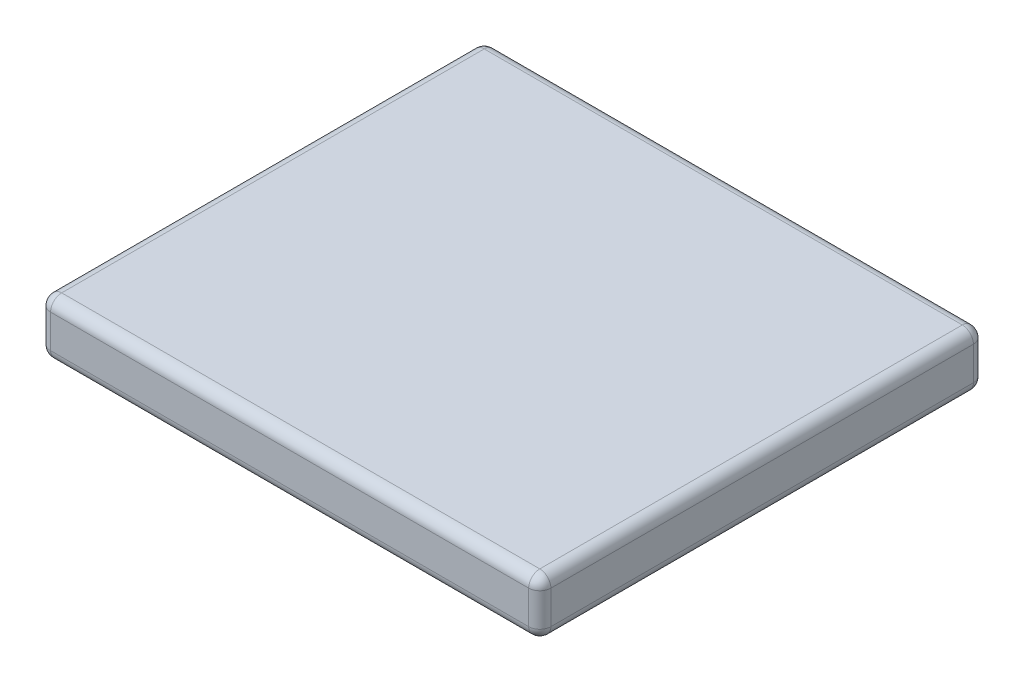
ISO-10303-21;
HEADER;
FILE_DESCRIPTION(('STEP AP214'),'2;1');
FILE_NAME('part.step','',(''),(''),'','','');
FILE_SCHEMA(('AUTOMOTIVE_DESIGN { 1 0 10303 214 1 1 1 1 }'));
ENDSEC;
DATA;
#1=APPLICATION_CONTEXT('core data for automotive mechanical design processes');
#2=APPLICATION_PROTOCOL_DEFINITION('international standard','automotive_design',2000,#1);
#3=PRODUCT_CONTEXT('',#1,'mechanical');
#4=PRODUCT('Part','Part','',(#3));
#5=PRODUCT_RELATED_PRODUCT_CATEGORY('part','',(#4));
#6=PRODUCT_DEFINITION_FORMATION('','',#4);
#7=PRODUCT_DEFINITION_CONTEXT('part definition',#1,'design');
#8=PRODUCT_DEFINITION('design','',#6,#7);
#9=PRODUCT_DEFINITION_SHAPE('','',#8);
#10=(LENGTH_UNIT() NAMED_UNIT(*) SI_UNIT(.MILLI.,.METRE.));
#11=(NAMED_UNIT(*) PLANE_ANGLE_UNIT() SI_UNIT($,.RADIAN.));
#12=(NAMED_UNIT(*) SI_UNIT($,.STERADIAN.) SOLID_ANGLE_UNIT());
#13=UNCERTAINTY_MEASURE_WITH_UNIT(LENGTH_MEASURE(1.E-05),#10,'distance_accuracy_value','');
#14=(GEOMETRIC_REPRESENTATION_CONTEXT(3) GLOBAL_UNCERTAINTY_ASSIGNED_CONTEXT((#13)) GLOBAL_UNIT_ASSIGNED_CONTEXT((#10,
#11,#12)) REPRESENTATION_CONTEXT('',''));
#15=CARTESIAN_POINT('',(0.,0.,0.));
#16=DIRECTION('',(0.,0.,1.));
#17=DIRECTION('',(1.,0.,0.));
#18=AXIS2_PLACEMENT_3D('',#15,#16,#17);
#19=CARTESIAN_POINT('',(45.,5.,80.));
#20=DIRECTION('',(-1.,0.,0.));
#21=DIRECTION('',(0.,0.,1.));
#22=AXIS2_PLACEMENT_3D('',#19,#20,#21);
#23=PLANE('',#22);
#24=DIRECTION('',(0.,0.,-1.));
#25=VECTOR('',#24,1.);
#26=CARTESIAN_POINT('',(45.,-3.,80.));
#27=LINE('',#26,#25);
#28=CARTESIAN_POINT('',(45.,-3.,78.));
#29=VERTEX_POINT('',#28);
#30=CARTESIAN_POINT('',(45.,-3.,2.));
#31=VERTEX_POINT('',#30);
#32=EDGE_CURVE('E225',#29,#31,#27,.T.);
#33=ORIENTED_EDGE('',*,*,#32,.T.);
#34=DIRECTION('',(0.,1.,0.));
#35=VECTOR('',#34,1.);
#36=CARTESIAN_POINT('',(45.,5.,2.));
#37=LINE('',#36,#35);
#38=CARTESIAN_POINT('',(45.,3.,2.));
#39=VERTEX_POINT('',#38);
#40=EDGE_CURVE('E229',#31,#39,#37,.T.);
#41=ORIENTED_EDGE('',*,*,#40,.T.);
#42=DIRECTION('',(0.,0.,-1.));
#43=VECTOR('',#42,1.);
#44=CARTESIAN_POINT('',(45.,3.,80.));
#45=LINE('',#44,#43);
#46=CARTESIAN_POINT('',(45.,3.,78.));
#47=VERTEX_POINT('',#46);
#48=EDGE_CURVE('E222',#39,#47,#45,.F.);
#49=ORIENTED_EDGE('',*,*,#48,.T.);
#50=DIRECTION('',(0.,1.,0.));
#51=VECTOR('',#50,1.);
#52=CARTESIAN_POINT('',(45.,-5.,78.));
#53=LINE('',#52,#51);
#54=EDGE_CURVE('E219',#47,#29,#53,.F.);
#55=ORIENTED_EDGE('',*,*,#54,.T.);
#56=EDGE_LOOP('',(#33,#41,#49,#55));
#57=FACE_BOUND('',#56,.T.);
#58=ADVANCED_FACE('F43',(#57),#23,.F.);
#59=CARTESIAN_POINT('',(-45.,5.,80.));
#60=DIRECTION('',(0.,-1.,0.));
#61=DIRECTION('',(0.,0.,-1.));
#62=AXIS2_PLACEMENT_3D('',#59,#60,#61);
#63=PLANE('',#62);
#64=DIRECTION('',(-1.,0.,0.));
#65=VECTOR('',#64,1.);
#66=CARTESIAN_POINT('',(-45.,5.,2.));
#67=LINE('',#66,#65);
#68=CARTESIAN_POINT('',(43.,5.,2.));
#69=VERTEX_POINT('',#68);
#70=CARTESIAN_POINT('',(-43.,5.,2.));
#71=VERTEX_POINT('',#70);
#72=EDGE_CURVE('E188',#69,#71,#67,.T.);
#73=ORIENTED_EDGE('',*,*,#72,.T.);
#74=DIRECTION('',(0.,0.,-1.));
#75=VECTOR('',#74,1.);
#76=CARTESIAN_POINT('',(-43.,5.,80.));
#77=LINE('',#76,#75);
#78=CARTESIAN_POINT('',(-43.,5.,78.));
#79=VERTEX_POINT('',#78);
#80=EDGE_CURVE('E191',#71,#79,#77,.F.);
#81=ORIENTED_EDGE('',*,*,#80,.T.);
#82=DIRECTION('',(-1.,0.,0.));
#83=VECTOR('',#82,1.);
#84=CARTESIAN_POINT('',(45.,5.,78.));
#85=LINE('',#84,#83);
#86=CARTESIAN_POINT('',(43.,5.,78.));
#87=VERTEX_POINT('',#86);
#88=EDGE_CURVE('E182',#79,#87,#85,.F.);
#89=ORIENTED_EDGE('',*,*,#88,.T.);
#90=DIRECTION('',(0.,0.,-1.));
#91=VECTOR('',#90,1.);
#92=CARTESIAN_POINT('',(43.,5.,80.));
#93=LINE('',#92,#91);
#94=EDGE_CURVE('E185',#87,#69,#93,.T.);
#95=ORIENTED_EDGE('',*,*,#94,.T.);
#96=EDGE_LOOP('',(#73,#81,#89,#95));
#97=FACE_BOUND('',#96,.T.);
#98=ADVANCED_FACE('F363',(#97),#63,.F.);
#99=CARTESIAN_POINT('',(-45.,5.,80.));
#100=DIRECTION('',(1.,0.,0.));
#101=DIRECTION('',(0.,0.,-1.));
#102=AXIS2_PLACEMENT_3D('',#99,#100,#101);
#103=PLANE('',#102);
#104=DIRECTION('',(0.,0.,-1.));
#105=VECTOR('',#104,1.);
#106=CARTESIAN_POINT('',(-45.,3.,80.));
#107=LINE('',#106,#105);
#108=CARTESIAN_POINT('',(-45.,3.,78.));
#109=VERTEX_POINT('',#108);
#110=CARTESIAN_POINT('',(-45.,3.,2.));
#111=VERTEX_POINT('',#110);
#112=EDGE_CURVE('E144',#109,#111,#107,.T.);
#113=ORIENTED_EDGE('',*,*,#112,.T.);
#114=DIRECTION('',(0.,-1.,0.));
#115=VECTOR('',#114,1.);
#116=CARTESIAN_POINT('',(-45.,5.,2.));
#117=LINE('',#116,#115);
#118=CARTESIAN_POINT('',(-45.,-3.,2.));
#119=VERTEX_POINT('',#118);
#120=EDGE_CURVE('E139',#111,#119,#117,.T.);
#121=ORIENTED_EDGE('',*,*,#120,.T.);
#122=DIRECTION('',(0.,0.,-1.));
#123=VECTOR('',#122,1.);
#124=CARTESIAN_POINT('',(-45.,-3.,80.));
#125=LINE('',#124,#123);
#126=CARTESIAN_POINT('',(-45.,-3.,78.));
#127=VERTEX_POINT('',#126);
#128=EDGE_CURVE('E131',#119,#127,#125,.F.);
#129=ORIENTED_EDGE('',*,*,#128,.T.);
#130=DIRECTION('',(0.,-1.,0.));
#131=VECTOR('',#130,1.);
#132=CARTESIAN_POINT('',(-45.,5.,78.));
#133=LINE('',#132,#131);
#134=EDGE_CURVE('E136',#127,#109,#133,.F.);
#135=ORIENTED_EDGE('',*,*,#134,.T.);
#136=EDGE_LOOP('',(#113,#121,#129,#135));
#137=FACE_BOUND('',#136,.T.);
#138=ADVANCED_FACE('F134',(#137),#103,.F.);
#139=CARTESIAN_POINT('',(-45.,-5.,80.));
#140=DIRECTION('',(0.,1.,0.));
#141=DIRECTION('',(0.,0.,1.));
#142=AXIS2_PLACEMENT_3D('',#139,#140,#141);
#143=PLANE('',#142);
#144=DIRECTION('',(1.,0.,0.));
#145=VECTOR('',#144,1.);
#146=CARTESIAN_POINT('',(-45.,-5.,78.));
#147=LINE('',#146,#145);
#148=CARTESIAN_POINT('',(43.,-5.,78.));
#149=VERTEX_POINT('',#148);
#150=CARTESIAN_POINT('',(-43.,-5.,78.));
#151=VERTEX_POINT('',#150);
#152=EDGE_CURVE('E195',#149,#151,#147,.F.);
#153=ORIENTED_EDGE('',*,*,#152,.T.);
#154=DIRECTION('',(0.,0.,-1.));
#155=VECTOR('',#154,1.);
#156=CARTESIAN_POINT('',(-43.,-5.,80.));
#157=LINE('',#156,#155);
#158=CARTESIAN_POINT('',(-43.,-5.,2.));
#159=VERTEX_POINT('',#158);
#160=EDGE_CURVE('E152',#151,#159,#157,.T.);
#161=ORIENTED_EDGE('',*,*,#160,.T.);
#162=DIRECTION('',(1.,0.,0.));
#163=VECTOR('',#162,1.);
#164=CARTESIAN_POINT('',(-45.,-5.,2.));
#165=LINE('',#164,#163);
#166=CARTESIAN_POINT('',(43.,-5.,2.));
#167=VERTEX_POINT('',#166);
#168=EDGE_CURVE('E201',#159,#167,#165,.T.);
#169=ORIENTED_EDGE('',*,*,#168,.T.);
#170=DIRECTION('',(0.,0.,-1.));
#171=VECTOR('',#170,1.);
#172=CARTESIAN_POINT('',(43.,-5.,80.));
#173=LINE('',#172,#171);
#174=EDGE_CURVE('E198',#167,#149,#173,.F.);
#175=ORIENTED_EDGE('',*,*,#174,.T.);
#176=EDGE_LOOP('',(#153,#161,#169,#175));
#177=FACE_BOUND('',#176,.T.);
#178=ADVANCED_FACE('F354',(#177),#143,.F.);
#179=CARTESIAN_POINT('',(0.,0.,80.));
#180=DIRECTION('',(0.,0.,1.));
#181=DIRECTION('',(1.,0.,0.));
#182=AXIS2_PLACEMENT_3D('',#179,#180,#181);
#183=PLANE('',#182);
#184=DIRECTION('',(0.,-1.,0.));
#185=VECTOR('',#184,1.);
#186=CARTESIAN_POINT('',(-43.,-5.,80.));
#187=LINE('',#186,#185);
#188=CARTESIAN_POINT('',(-43.,3.,80.));
#189=VERTEX_POINT('',#188);
#190=CARTESIAN_POINT('',(-43.,-3.,80.));
#191=VERTEX_POINT('',#190);
#192=EDGE_CURVE('E53',#189,#191,#187,.T.);
#193=ORIENTED_EDGE('',*,*,#192,.T.);
#194=DIRECTION('',(1.,0.,0.));
#195=VECTOR('',#194,1.);
#196=CARTESIAN_POINT('',(45.,-3.,80.));
#197=LINE('',#196,#195);
#198=CARTESIAN_POINT('',(43.,-3.,80.));
#199=VERTEX_POINT('',#198);
#200=EDGE_CURVE('E11',#191,#199,#197,.T.);
#201=ORIENTED_EDGE('',*,*,#200,.T.);
#202=DIRECTION('',(0.,1.,0.));
#203=VECTOR('',#202,1.);
#204=CARTESIAN_POINT('',(43.,5.,80.));
#205=LINE('',#204,#203);
#206=CARTESIAN_POINT('',(43.,3.,80.));
#207=VERTEX_POINT('',#206);
#208=EDGE_CURVE('E232',#199,#207,#205,.T.);
#209=ORIENTED_EDGE('',*,*,#208,.T.);
#210=DIRECTION('',(-1.,0.,0.));
#211=VECTOR('',#210,1.);
#212=CARTESIAN_POINT('',(-45.,3.,80.));
#213=LINE('',#212,#211);
#214=EDGE_CURVE('E64',#207,#189,#213,.T.);
#215=ORIENTED_EDGE('',*,*,#214,.T.);
#216=EDGE_LOOP('',(#193,#201,#209,#215));
#217=FACE_BOUND('',#216,.T.);
#218=ADVANCED_FACE('F356',(#217),#183,.T.);
#219=CARTESIAN_POINT('',(0.,0.,0.));
#220=DIRECTION('',(0.,0.,1.));
#221=DIRECTION('',(1.,0.,0.));
#222=AXIS2_PLACEMENT_3D('',#219,#220,#221);
#223=PLANE('',#222);
#224=DIRECTION('',(0.,-1.,0.));
#225=VECTOR('',#224,1.);
#226=CARTESIAN_POINT('',(-43.,0.,0.));
#227=LINE('',#226,#225);
#228=CARTESIAN_POINT('',(-43.,-3.,0.));
#229=VERTEX_POINT('',#228);
#230=CARTESIAN_POINT('',(-43.,3.,0.));
#231=VERTEX_POINT('',#230);
#232=EDGE_CURVE('E212',#229,#231,#227,.F.);
#233=ORIENTED_EDGE('',*,*,#232,.T.);
#234=DIRECTION('',(-1.,0.,0.));
#235=VECTOR('',#234,1.);
#236=CARTESIAN_POINT('',(0.,3.,0.));
#237=LINE('',#236,#235);
#238=CARTESIAN_POINT('',(43.,3.,0.));
#239=VERTEX_POINT('',#238);
#240=EDGE_CURVE('E215',#231,#239,#237,.F.);
#241=ORIENTED_EDGE('',*,*,#240,.T.);
#242=DIRECTION('',(0.,1.,0.));
#243=VECTOR('',#242,1.);
#244=CARTESIAN_POINT('',(43.,0.,0.));
#245=LINE('',#244,#243);
#246=CARTESIAN_POINT('',(43.,-3.,0.));
#247=VERTEX_POINT('',#246);
#248=EDGE_CURVE('E206',#239,#247,#245,.F.);
#249=ORIENTED_EDGE('',*,*,#248,.T.);
#250=DIRECTION('',(1.,0.,0.));
#251=VECTOR('',#250,1.);
#252=CARTESIAN_POINT('',(0.,-3.,0.));
#253=LINE('',#252,#251);
#254=EDGE_CURVE('E209',#247,#229,#253,.F.);
#255=ORIENTED_EDGE('',*,*,#254,.T.);
#256=EDGE_LOOP('',(#233,#241,#249,#255));
#257=FACE_BOUND('',#256,.T.);
#258=ADVANCED_FACE('F323',(#257),#223,.F.);
#259=CARTESIAN_POINT('',(43.,-3.,80.));
#260=DIRECTION('',(0.,0.,-1.));
#261=DIRECTION('',(-1.,0.,0.));
#262=AXIS2_PLACEMENT_3D('',#259,#260,#261);
#263=CYLINDRICAL_SURFACE('',#262,2.);
#264=CARTESIAN_POINT('',(43.,-3.,78.));
#265=DIRECTION('',(0.,0.,1.));
#266=DIRECTION('',(1.,0.,0.));
#267=AXIS2_PLACEMENT_3D('',#264,#265,#266);
#268=CIRCLE('',#267,2.);
#269=EDGE_CURVE('E47',#149,#29,#268,.T.);
#270=ORIENTED_EDGE('',*,*,#269,.F.);
#271=ORIENTED_EDGE('',*,*,#174,.F.);
#272=CARTESIAN_POINT('',(43.,-3.,2.));
#273=DIRECTION('',(0.,0.,-1.));
#274=DIRECTION('',(-1.,0.,0.));
#275=AXIS2_PLACEMENT_3D('',#272,#273,#274);
#276=CIRCLE('',#275,2.);
#277=EDGE_CURVE('E176',#31,#167,#276,.T.);
#278=ORIENTED_EDGE('',*,*,#277,.F.);
#279=ORIENTED_EDGE('',*,*,#32,.F.);
#280=EDGE_LOOP('',(#270,#271,#278,#279));
#281=FACE_BOUND('',#280,.T.);
#282=ADVANCED_FACE('F45',(#281),#263,.T.);
#283=CARTESIAN_POINT('',(43.,-3.,78.));
#284=DIRECTION('',(1.,0.,0.));
#285=DIRECTION('',(0.,0.,-1.));
#286=AXIS2_PLACEMENT_3D('',#283,#284,#285);
#287=SPHERICAL_SURFACE('',#286,2.);
#288=CARTESIAN_POINT('',(43.,-3.,78.));
#289=DIRECTION('',(1.,0.,0.));
#290=DIRECTION('',(0.,0.,-1.));
#291=AXIS2_PLACEMENT_3D('',#288,#289,#290);
#292=CIRCLE('',#291,2.);
#293=EDGE_CURVE('E299',#149,#199,#292,.F.);
#294=ORIENTED_EDGE('',*,*,#293,.F.);
#295=ORIENTED_EDGE('',*,*,#269,.T.);
#296=CARTESIAN_POINT('',(43.,-3.,78.));
#297=DIRECTION('',(0.,-1.,0.));
#298=DIRECTION('',(0.,0.,-1.));
#299=AXIS2_PLACEMENT_3D('',#296,#297,#298);
#300=CIRCLE('',#299,2.);
#301=EDGE_CURVE('E303',#199,#29,#300,.F.);
#302=ORIENTED_EDGE('',*,*,#301,.F.);
#303=EDGE_LOOP('',(#294,#295,#302));
#304=FACE_BOUND('',#303,.T.);
#305=ADVANCED_FACE('F349',(#304),#287,.T.);
#306=CARTESIAN_POINT('',(43.,-3.,2.));
#307=DIRECTION('',(0.,-1.,0.));
#308=DIRECTION('',(0.,0.,-1.));
#309=AXIS2_PLACEMENT_3D('',#306,#307,#308);
#310=SPHERICAL_SURFACE('',#309,2.);
#311=CARTESIAN_POINT('',(43.,-3.,2.));
#312=DIRECTION('',(0.,-1.,0.));
#313=DIRECTION('',(0.,0.,-1.));
#314=AXIS2_PLACEMENT_3D('',#311,#312,#313);
#315=CIRCLE('',#314,2.);
#316=EDGE_CURVE('E291',#31,#247,#315,.F.);
#317=ORIENTED_EDGE('',*,*,#316,.F.);
#318=ORIENTED_EDGE('',*,*,#277,.T.);
#319=CARTESIAN_POINT('',(43.,-3.,2.));
#320=DIRECTION('',(1.,0.,0.));
#321=DIRECTION('',(0.,0.,-1.));
#322=AXIS2_PLACEMENT_3D('',#319,#320,#321);
#323=CIRCLE('',#322,2.);
#324=EDGE_CURVE('E295',#247,#167,#323,.F.);
#325=ORIENTED_EDGE('',*,*,#324,.F.);
#326=EDGE_LOOP('',(#317,#318,#325));
#327=FACE_BOUND('',#326,.T.);
#328=ADVANCED_FACE('F312',(#327),#310,.T.);
#329=CARTESIAN_POINT('',(43.,0.,78.));
#330=DIRECTION('',(0.,-1.,0.));
#331=DIRECTION('',(0.,0.,-1.));
#332=AXIS2_PLACEMENT_3D('',#329,#330,#331);
#333=CYLINDRICAL_SURFACE('',#332,2.);
#334=ORIENTED_EDGE('',*,*,#301,.T.);
#335=ORIENTED_EDGE('',*,*,#54,.F.);
#336=CARTESIAN_POINT('',(43.,3.,78.));
#337=DIRECTION('',(0.,1.,0.));
#338=DIRECTION('',(0.,0.,1.));
#339=AXIS2_PLACEMENT_3D('',#336,#337,#338);
#340=CIRCLE('',#339,2.);
#341=EDGE_CURVE('E283',#207,#47,#340,.T.);
#342=ORIENTED_EDGE('',*,*,#341,.F.);
#343=ORIENTED_EDGE('',*,*,#208,.F.);
#344=EDGE_LOOP('',(#334,#335,#342,#343));
#345=FACE_BOUND('',#344,.T.);
#346=ADVANCED_FACE('F344',(#345),#333,.T.);
#347=CARTESIAN_POINT('',(0.,-3.,78.));
#348=DIRECTION('',(-1.,0.,0.));
#349=DIRECTION('',(0.,0.,1.));
#350=AXIS2_PLACEMENT_3D('',#347,#348,#349);
#351=CYLINDRICAL_SURFACE('',#350,2.);
#352=ORIENTED_EDGE('',*,*,#293,.T.);
#353=ORIENTED_EDGE('',*,*,#200,.F.);
#354=CARTESIAN_POINT('',(-43.,-3.,78.));
#355=DIRECTION('',(-1.,0.,0.));
#356=DIRECTION('',(0.,0.,1.));
#357=AXIS2_PLACEMENT_3D('',#354,#355,#356);
#358=CIRCLE('',#357,2.);
#359=EDGE_CURVE('E157',#151,#191,#358,.T.);
#360=ORIENTED_EDGE('',*,*,#359,.F.);
#361=ORIENTED_EDGE('',*,*,#152,.F.);
#362=EDGE_LOOP('',(#352,#353,#360,#361));
#363=FACE_BOUND('',#362,.T.);
#364=ADVANCED_FACE('F352',(#363),#351,.T.);
#365=CARTESIAN_POINT('',(-43.,-3.,80.));
#366=DIRECTION('',(0.,0.,-1.));
#367=DIRECTION('',(-1.,0.,0.));
#368=AXIS2_PLACEMENT_3D('',#365,#366,#367);
#369=CYLINDRICAL_SURFACE('',#368,2.);
#370=CARTESIAN_POINT('',(-43.,-3.,2.));
#371=DIRECTION('',(0.,0.,-1.));
#372=DIRECTION('',(-1.,0.,0.));
#373=AXIS2_PLACEMENT_3D('',#370,#371,#372);
#374=CIRCLE('',#373,2.);
#375=EDGE_CURVE('E158',#159,#119,#374,.T.);
#376=ORIENTED_EDGE('',*,*,#375,.F.);
#377=ORIENTED_EDGE('',*,*,#160,.F.);
#378=CARTESIAN_POINT('',(-43.,-3.,78.));
#379=DIRECTION('',(0.,0.,1.));
#380=DIRECTION('',(1.,0.,0.));
#381=AXIS2_PLACEMENT_3D('',#378,#379,#380);
#382=CIRCLE('',#381,2.);
#383=EDGE_CURVE('E148',#127,#151,#382,.T.);
#384=ORIENTED_EDGE('',*,*,#383,.F.);
#385=ORIENTED_EDGE('',*,*,#128,.F.);
#386=EDGE_LOOP('',(#376,#377,#384,#385));
#387=FACE_BOUND('',#386,.T.);
#388=ADVANCED_FACE('F150',(#387),#369,.T.);
#389=CARTESIAN_POINT('',(-45.,-3.,2.));
#390=DIRECTION('',(1.,0.,0.));
#391=DIRECTION('',(0.,0.,-1.));
#392=AXIS2_PLACEMENT_3D('',#389,#390,#391);
#393=CYLINDRICAL_SURFACE('',#392,2.);
#394=ORIENTED_EDGE('',*,*,#324,.T.);
#395=ORIENTED_EDGE('',*,*,#168,.F.);
#396=CARTESIAN_POINT('',(-43.,-3.,2.));
#397=DIRECTION('',(-1.,0.,0.));
#398=DIRECTION('',(0.,0.,1.));
#399=AXIS2_PLACEMENT_3D('',#396,#397,#398);
#400=CIRCLE('',#399,2.);
#401=EDGE_CURVE('E276',#229,#159,#400,.T.);
#402=ORIENTED_EDGE('',*,*,#401,.F.);
#403=ORIENTED_EDGE('',*,*,#254,.F.);
#404=EDGE_LOOP('',(#394,#395,#402,#403));
#405=FACE_BOUND('',#404,.T.);
#406=ADVANCED_FACE('F319',(#405),#393,.T.);
#407=CARTESIAN_POINT('',(43.,5.,2.));
#408=DIRECTION('',(0.,1.,0.));
#409=DIRECTION('',(0.,0.,1.));
#410=AXIS2_PLACEMENT_3D('',#407,#408,#409);
#411=CYLINDRICAL_SURFACE('',#410,2.);
#412=ORIENTED_EDGE('',*,*,#316,.T.);
#413=ORIENTED_EDGE('',*,*,#248,.F.);
#414=CARTESIAN_POINT('',(43.,3.,2.));
#415=DIRECTION('',(0.,1.,0.));
#416=DIRECTION('',(0.,0.,1.));
#417=AXIS2_PLACEMENT_3D('',#414,#415,#416);
#418=CIRCLE('',#417,2.);
#419=EDGE_CURVE('E272',#39,#239,#418,.T.);
#420=ORIENTED_EDGE('',*,*,#419,.F.);
#421=ORIENTED_EDGE('',*,*,#40,.F.);
#422=EDGE_LOOP('',(#412,#413,#420,#421));
#423=FACE_BOUND('',#422,.T.);
#424=ADVANCED_FACE('F329',(#423),#411,.T.);
#425=CARTESIAN_POINT('',(43.,3.,80.));
#426=DIRECTION('',(0.,0.,-1.));
#427=DIRECTION('',(-1.,0.,0.));
#428=AXIS2_PLACEMENT_3D('',#425,#426,#427);
#429=CYLINDRICAL_SURFACE('',#428,2.);
#430=CARTESIAN_POINT('',(43.,3.,78.));
#431=DIRECTION('',(0.,0.,1.));
#432=DIRECTION('',(1.,0.,0.));
#433=AXIS2_PLACEMENT_3D('',#430,#431,#432);
#434=CIRCLE('',#433,2.);
#435=EDGE_CURVE('E287',#47,#87,#434,.T.);
#436=ORIENTED_EDGE('',*,*,#435,.F.);
#437=ORIENTED_EDGE('',*,*,#48,.F.);
#438=CARTESIAN_POINT('',(43.,3.,2.));
#439=DIRECTION('',(0.,0.,-1.));
#440=DIRECTION('',(-1.,0.,0.));
#441=AXIS2_PLACEMENT_3D('',#438,#439,#440);
#442=CIRCLE('',#441,2.);
#443=EDGE_CURVE('E268',#69,#39,#442,.T.);
#444=ORIENTED_EDGE('',*,*,#443,.F.);
#445=ORIENTED_EDGE('',*,*,#94,.F.);
#446=EDGE_LOOP('',(#436,#437,#444,#445));
#447=FACE_BOUND('',#446,.T.);
#448=ADVANCED_FACE('F336',(#447),#429,.T.);
#449=CARTESIAN_POINT('',(43.,3.,78.));
#450=DIRECTION('',(1.,0.,0.));
#451=DIRECTION('',(0.,0.,-1.));
#452=AXIS2_PLACEMENT_3D('',#449,#450,#451);
#453=SPHERICAL_SURFACE('',#452,2.);
#454=ORIENTED_EDGE('',*,*,#341,.T.);
#455=ORIENTED_EDGE('',*,*,#435,.T.);
#456=CARTESIAN_POINT('',(43.,3.,78.));
#457=DIRECTION('',(1.,0.,0.));
#458=DIRECTION('',(0.,0.,-1.));
#459=AXIS2_PLACEMENT_3D('',#456,#457,#458);
#460=CIRCLE('',#459,2.);
#461=EDGE_CURVE('E165',#207,#87,#460,.F.);
#462=ORIENTED_EDGE('',*,*,#461,.F.);
#463=EDGE_LOOP('',(#454,#455,#462));
#464=FACE_BOUND('',#463,.T.);
#465=ADVANCED_FACE('F342',(#464),#453,.T.);
#466=CARTESIAN_POINT('',(-43.,-3.,78.));
#467=DIRECTION('',(0.,-1.,0.));
#468=DIRECTION('',(0.,0.,-1.));
#469=AXIS2_PLACEMENT_3D('',#466,#467,#468);
#470=SPHERICAL_SURFACE('',#469,2.);
#471=ORIENTED_EDGE('',*,*,#383,.T.);
#472=ORIENTED_EDGE('',*,*,#359,.T.);
#473=CARTESIAN_POINT('',(-43.,-3.,78.));
#474=DIRECTION('',(0.,-1.,0.));
#475=DIRECTION('',(0.,0.,-1.));
#476=AXIS2_PLACEMENT_3D('',#473,#474,#475);
#477=CIRCLE('',#476,2.);
#478=EDGE_CURVE('E161',#127,#191,#477,.F.);
#479=ORIENTED_EDGE('',*,*,#478,.F.);
#480=EDGE_LOOP('',(#471,#472,#479));
#481=FACE_BOUND('',#480,.T.);
#482=ADVANCED_FACE('F162',(#481),#470,.T.);
#483=CARTESIAN_POINT('',(-43.,-3.,2.));
#484=DIRECTION('',(0.,-1.,0.));
#485=DIRECTION('',(0.,0.,-1.));
#486=AXIS2_PLACEMENT_3D('',#483,#484,#485);
#487=SPHERICAL_SURFACE('',#486,2.);
#488=ORIENTED_EDGE('',*,*,#401,.T.);
#489=ORIENTED_EDGE('',*,*,#375,.T.);
#490=CARTESIAN_POINT('',(-43.,-3.,2.));
#491=DIRECTION('',(0.,-1.,0.));
#492=DIRECTION('',(0.,0.,-1.));
#493=AXIS2_PLACEMENT_3D('',#490,#491,#492);
#494=CIRCLE('',#493,2.);
#495=EDGE_CURVE('E166',#229,#119,#494,.F.);
#496=ORIENTED_EDGE('',*,*,#495,.F.);
#497=EDGE_LOOP('',(#488,#489,#496));
#498=FACE_BOUND('',#497,.T.);
#499=ADVANCED_FACE('F403',(#498),#487,.T.);
#500=CARTESIAN_POINT('',(43.,3.,2.));
#501=DIRECTION('',(1.,0.,0.));
#502=DIRECTION('',(0.,0.,-1.));
#503=AXIS2_PLACEMENT_3D('',#500,#501,#502);
#504=SPHERICAL_SURFACE('',#503,2.);
#505=ORIENTED_EDGE('',*,*,#443,.T.);
#506=ORIENTED_EDGE('',*,*,#419,.T.);
#507=CARTESIAN_POINT('',(43.,3.,2.));
#508=DIRECTION('',(1.,0.,0.));
#509=DIRECTION('',(0.,0.,-1.));
#510=AXIS2_PLACEMENT_3D('',#507,#508,#509);
#511=CIRCLE('',#510,2.);
#512=EDGE_CURVE('E259',#69,#239,#511,.F.);
#513=ORIENTED_EDGE('',*,*,#512,.F.);
#514=EDGE_LOOP('',(#505,#506,#513));
#515=FACE_BOUND('',#514,.T.);
#516=ADVANCED_FACE('F399',(#515),#504,.T.);
#517=CARTESIAN_POINT('',(0.,3.,78.));
#518=DIRECTION('',(1.,0.,0.));
#519=DIRECTION('',(0.,0.,-1.));
#520=AXIS2_PLACEMENT_3D('',#517,#518,#519);
#521=CYLINDRICAL_SURFACE('',#520,2.);
#522=ORIENTED_EDGE('',*,*,#461,.T.);
#523=ORIENTED_EDGE('',*,*,#88,.F.);
#524=CARTESIAN_POINT('',(-43.,3.,78.));
#525=DIRECTION('',(-1.,0.,0.));
#526=DIRECTION('',(0.,0.,1.));
#527=AXIS2_PLACEMENT_3D('',#524,#525,#526);
#528=CIRCLE('',#527,2.);
#529=EDGE_CURVE('E255',#189,#79,#528,.T.);
#530=ORIENTED_EDGE('',*,*,#529,.F.);
#531=ORIENTED_EDGE('',*,*,#214,.F.);
#532=EDGE_LOOP('',(#522,#523,#530,#531));
#533=FACE_BOUND('',#532,.T.);
#534=ADVANCED_FACE('F396',(#533),#521,.T.);
#535=CARTESIAN_POINT('',(-43.,0.,78.));
#536=DIRECTION('',(0.,1.,0.));
#537=DIRECTION('',(0.,0.,1.));
#538=AXIS2_PLACEMENT_3D('',#535,#536,#537);
#539=CYLINDRICAL_SURFACE('',#538,2.);
#540=ORIENTED_EDGE('',*,*,#478,.T.);
#541=ORIENTED_EDGE('',*,*,#192,.F.);
#542=CARTESIAN_POINT('',(-43.,3.,78.));
#543=DIRECTION('',(0.,1.,0.));
#544=DIRECTION('',(0.,0.,1.));
#545=AXIS2_PLACEMENT_3D('',#542,#543,#544);
#546=CIRCLE('',#545,2.);
#547=EDGE_CURVE('E170',#109,#189,#546,.T.);
#548=ORIENTED_EDGE('',*,*,#547,.F.);
#549=ORIENTED_EDGE('',*,*,#134,.F.);
#550=EDGE_LOOP('',(#540,#541,#548,#549));
#551=FACE_BOUND('',#550,.T.);
#552=ADVANCED_FACE('F168',(#551),#539,.T.);
#553=CARTESIAN_POINT('',(-43.,5.,2.));
#554=DIRECTION('',(0.,-1.,0.));
#555=DIRECTION('',(0.,0.,-1.));
#556=AXIS2_PLACEMENT_3D('',#553,#554,#555);
#557=CYLINDRICAL_SURFACE('',#556,2.);
#558=ORIENTED_EDGE('',*,*,#495,.T.);
#559=ORIENTED_EDGE('',*,*,#120,.F.);
#560=CARTESIAN_POINT('',(-43.,3.,2.));
#561=DIRECTION('',(0.,1.,0.));
#562=DIRECTION('',(0.,0.,1.));
#563=AXIS2_PLACEMENT_3D('',#560,#561,#562);
#564=CIRCLE('',#563,2.);
#565=EDGE_CURVE('E249',#231,#111,#564,.T.);
#566=ORIENTED_EDGE('',*,*,#565,.F.);
#567=ORIENTED_EDGE('',*,*,#232,.F.);
#568=EDGE_LOOP('',(#558,#559,#566,#567));
#569=FACE_BOUND('',#568,.T.);
#570=ADVANCED_FACE('F389',(#569),#557,.T.);
#571=CARTESIAN_POINT('',(-45.,3.,2.));
#572=DIRECTION('',(-1.,0.,0.));
#573=DIRECTION('',(0.,0.,1.));
#574=AXIS2_PLACEMENT_3D('',#571,#572,#573);
#575=CYLINDRICAL_SURFACE('',#574,2.);
#576=ORIENTED_EDGE('',*,*,#512,.T.);
#577=ORIENTED_EDGE('',*,*,#240,.F.);
#578=CARTESIAN_POINT('',(-43.,3.,2.));
#579=DIRECTION('',(-1.,0.,0.));
#580=DIRECTION('',(0.,0.,1.));
#581=AXIS2_PLACEMENT_3D('',#578,#579,#580);
#582=CIRCLE('',#581,2.);
#583=EDGE_CURVE('E245',#71,#231,#582,.T.);
#584=ORIENTED_EDGE('',*,*,#583,.F.);
#585=ORIENTED_EDGE('',*,*,#72,.F.);
#586=EDGE_LOOP('',(#576,#577,#584,#585));
#587=FACE_BOUND('',#586,.T.);
#588=ADVANCED_FACE('F385',(#587),#575,.T.);
#589=CARTESIAN_POINT('',(-43.,3.,78.));
#590=DIRECTION('',(0.,0.,1.));
#591=DIRECTION('',(1.,0.,0.));
#592=AXIS2_PLACEMENT_3D('',#589,#590,#591);
#593=SPHERICAL_SURFACE('',#592,2.);
#594=ORIENTED_EDGE('',*,*,#547,.T.);
#595=ORIENTED_EDGE('',*,*,#529,.T.);
#596=CARTESIAN_POINT('',(-43.,3.,78.));
#597=DIRECTION('',(0.,0.,1.));
#598=DIRECTION('',(1.,0.,0.));
#599=AXIS2_PLACEMENT_3D('',#596,#597,#598);
#600=CIRCLE('',#599,2.);
#601=EDGE_CURVE('E242',#109,#79,#600,.F.);
#602=ORIENTED_EDGE('',*,*,#601,.F.);
#603=EDGE_LOOP('',(#594,#595,#602));
#604=FACE_BOUND('',#603,.T.);
#605=ADVANCED_FACE('F381',(#604),#593,.T.);
#606=CARTESIAN_POINT('',(-43.,3.,2.));
#607=DIRECTION('',(0.,0.,-1.));
#608=DIRECTION('',(-1.,0.,0.));
#609=AXIS2_PLACEMENT_3D('',#606,#607,#608);
#610=SPHERICAL_SURFACE('',#609,2.);
#611=ORIENTED_EDGE('',*,*,#583,.T.);
#612=ORIENTED_EDGE('',*,*,#565,.T.);
#613=CARTESIAN_POINT('',(-43.,3.,2.));
#614=DIRECTION('',(0.,0.,-1.));
#615=DIRECTION('',(-1.,0.,0.));
#616=AXIS2_PLACEMENT_3D('',#613,#614,#615);
#617=CIRCLE('',#616,2.);
#618=EDGE_CURVE('E239',#71,#111,#617,.F.);
#619=ORIENTED_EDGE('',*,*,#618,.F.);
#620=EDGE_LOOP('',(#611,#612,#619));
#621=FACE_BOUND('',#620,.T.);
#622=ADVANCED_FACE('F377',(#621),#610,.T.);
#623=CARTESIAN_POINT('',(-43.,3.,80.));
#624=DIRECTION('',(0.,0.,-1.));
#625=DIRECTION('',(-1.,0.,0.));
#626=AXIS2_PLACEMENT_3D('',#623,#624,#625);
#627=CYLINDRICAL_SURFACE('',#626,2.);
#628=ORIENTED_EDGE('',*,*,#601,.T.);
#629=ORIENTED_EDGE('',*,*,#80,.F.);
#630=ORIENTED_EDGE('',*,*,#618,.T.);
#631=ORIENTED_EDGE('',*,*,#112,.F.);
#632=EDGE_LOOP('',(#628,#629,#630,#631));
#633=FACE_BOUND('',#632,.T.);
#634=ADVANCED_FACE('F374',(#633),#627,.T.);
#635=CLOSED_SHELL('',(#58,#98,#138,#178,#218,#258,#282,#305,#328,#346,#364,#388,#406,#424,#448,
#465,#482,#499,#516,#534,#552,#570,#588,#605,#622,#634));
#636=MANIFOLD_SOLID_BREP('B2',#635);
#637=ADVANCED_BREP_SHAPE_REPRESENTATION('',(#18,#636),#14);
#638=SHAPE_DEFINITION_REPRESENTATION(#9,#637);
ENDSEC;
END-ISO-10303-21;
